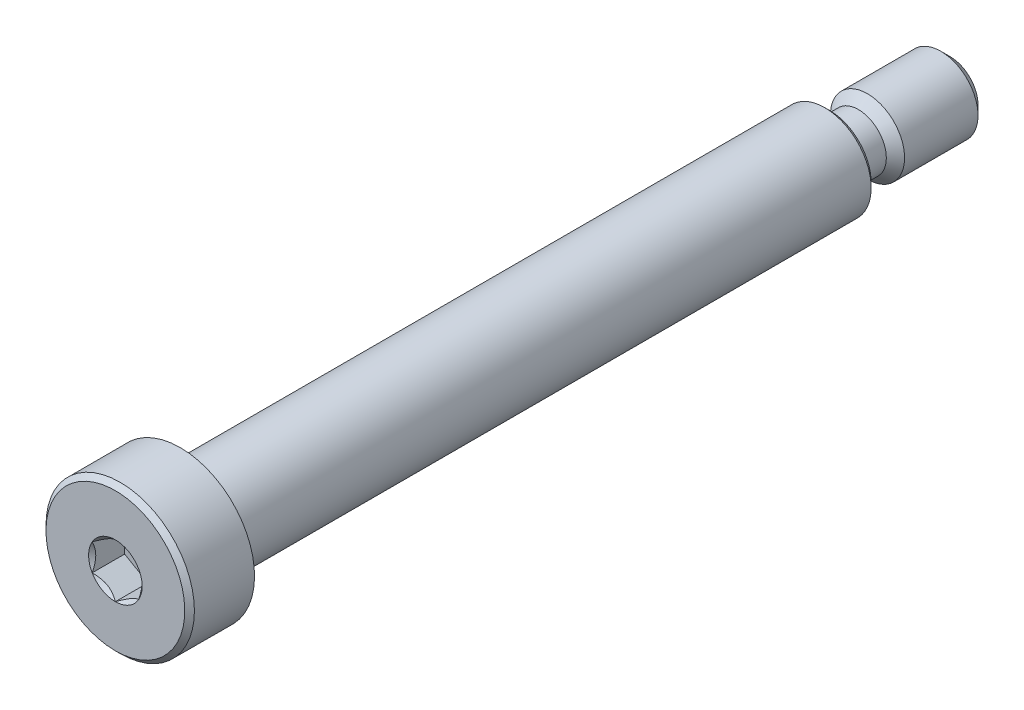
ISO-10303-21;
HEADER;
FILE_DESCRIPTION(('STEP AP214'),'2;1');
FILE_NAME('part.step','',(''),(''),'','','');
FILE_SCHEMA(('AUTOMOTIVE_DESIGN { 1 0 10303 214 1 1 1 1 }'));
ENDSEC;
DATA;
#1=APPLICATION_CONTEXT('core data for automotive mechanical design processes');
#2=APPLICATION_PROTOCOL_DEFINITION('international standard','automotive_design',2000,#1);
#3=PRODUCT_CONTEXT('',#1,'mechanical');
#4=PRODUCT('Part','Part','',(#3));
#5=PRODUCT_RELATED_PRODUCT_CATEGORY('part','',(#4));
#6=PRODUCT_DEFINITION_FORMATION('','',#4);
#7=PRODUCT_DEFINITION_CONTEXT('part definition',#1,'design');
#8=PRODUCT_DEFINITION('design','',#6,#7);
#9=PRODUCT_DEFINITION_SHAPE('','',#8);
#10=(LENGTH_UNIT() NAMED_UNIT(*) SI_UNIT(.MILLI.,.METRE.));
#11=(NAMED_UNIT(*) PLANE_ANGLE_UNIT() SI_UNIT($,.RADIAN.));
#12=(NAMED_UNIT(*) SI_UNIT($,.STERADIAN.) SOLID_ANGLE_UNIT());
#13=UNCERTAINTY_MEASURE_WITH_UNIT(LENGTH_MEASURE(1.E-05),#10,'distance_accuracy_value','');
#14=(GEOMETRIC_REPRESENTATION_CONTEXT(3) GLOBAL_UNCERTAINTY_ASSIGNED_CONTEXT((#13)) GLOBAL_UNIT_ASSIGNED_CONTEXT((#10,
#11,#12)) REPRESENTATION_CONTEXT('',''));
#15=CARTESIAN_POINT('',(0.,0.,0.));
#16=DIRECTION('',(0.,0.,1.));
#17=DIRECTION('',(1.,0.,0.));
#18=AXIS2_PLACEMENT_3D('',#15,#16,#17);
#19=CARTESIAN_POINT('',(0.,0.,0.));
#20=DIRECTION('',(0.,0.,1.));
#21=DIRECTION('',(0.,-1.,0.));
#22=AXIS2_PLACEMENT_3D('',#19,#20,#21);
#23=PLANE('',#22);
#24=CARTESIAN_POINT('',(0.,0.,0.));
#25=DIRECTION('',(0.,0.,1.));
#26=DIRECTION('',(1.,0.,0.));
#27=AXIS2_PLACEMENT_3D('',#24,#25,#26);
#28=CIRCLE('',#27,2.88675134594813);
#29=CARTESIAN_POINT('',(0.,-2.88675134594813,0.));
#30=VERTEX_POINT('',#29);
#31=CARTESIAN_POINT('',(2.5,-1.44337567297407,0.));
#32=VERTEX_POINT('',#31);
#33=EDGE_CURVE('E58',#30,#32,#28,.T.);
#34=ORIENTED_EDGE('',*,*,#33,.F.);
#35=CARTESIAN_POINT('',(-2.5,-1.44337567297407,0.));
#36=VERTEX_POINT('',#35);
#37=EDGE_CURVE('E65',#36,#30,#28,.T.);
#38=ORIENTED_EDGE('',*,*,#37,.F.);
#39=CARTESIAN_POINT('',(-2.5,1.44337567297407,0.));
#40=VERTEX_POINT('',#39);
#41=EDGE_CURVE('E138',#40,#36,#28,.T.);
#42=ORIENTED_EDGE('',*,*,#41,.F.);
#43=CARTESIAN_POINT('',(0.,2.88675134594813,0.));
#44=VERTEX_POINT('',#43);
#45=EDGE_CURVE('E133',#44,#40,#28,.T.);
#46=ORIENTED_EDGE('',*,*,#45,.F.);
#47=CARTESIAN_POINT('',(2.5,1.44337567297407,0.));
#48=VERTEX_POINT('',#47);
#49=EDGE_CURVE('E106',#48,#44,#28,.T.);
#50=ORIENTED_EDGE('',*,*,#49,.F.);
#51=EDGE_CURVE('E97',#32,#48,#28,.T.);
#52=ORIENTED_EDGE('',*,*,#51,.F.);
#53=EDGE_LOOP('',(#34,#38,#42,#46,#50,#52));
#54=FACE_BOUND('',#53,.T.);
#55=CARTESIAN_POINT('',(0.,0.,0.));
#56=DIRECTION('',(0.,0.,1.));
#57=DIRECTION('',(0.,-1.,0.));
#58=AXIS2_PLACEMENT_3D('',#55,#56,#57);
#59=CIRCLE('',#58,7.48000000000001);
#60=CARTESIAN_POINT('',(0.,-7.48000000000001,0.));
#61=VERTEX_POINT('',#60);
#62=EDGE_CURVE('E52',#61,#61,#59,.T.);
#63=ORIENTED_EDGE('',*,*,#62,.T.);
#64=EDGE_LOOP('',(#63));
#65=FACE_BOUND('',#64,.T.);
#66=ADVANCED_FACE('F39',(#54,#65),#23,.T.);
#67=CARTESIAN_POINT('',(0.,0.,-90.));
#68=DIRECTION('',(0.,0.,-1.));
#69=DIRECTION('',(0.,1.,0.));
#70=AXIS2_PLACEMENT_3D('',#67,#68,#69);
#71=CYLINDRICAL_SURFACE('',#70,8.);
#72=CARTESIAN_POINT('',(0.,0.,-0.519999999999979));
#73=DIRECTION('',(0.,0.,1.));
#74=DIRECTION('',(0.,-1.,0.));
#75=AXIS2_PLACEMENT_3D('',#72,#73,#74);
#76=CIRCLE('',#75,8.);
#77=CARTESIAN_POINT('',(0.,-8.,-0.519999999999979));
#78=VERTEX_POINT('',#77);
#79=EDGE_CURVE('E225',#78,#78,#76,.F.);
#80=ORIENTED_EDGE('',*,*,#79,.T.);
#81=EDGE_LOOP('',(#80));
#82=FACE_BOUND('',#81,.T.);
#83=CARTESIAN_POINT('',(0.,0.,-7.00000000000001));
#84=DIRECTION('',(0.,0.,-1.));
#85=DIRECTION('',(0.,1.,0.));
#86=AXIS2_PLACEMENT_3D('',#83,#84,#85);
#87=CIRCLE('',#86,8.);
#88=CARTESIAN_POINT('',(0.,8.,-7.00000000000001));
#89=VERTEX_POINT('',#88);
#90=EDGE_CURVE('E240',#89,#89,#87,.T.);
#91=ORIENTED_EDGE('',*,*,#90,.F.);
#92=EDGE_LOOP('',(#91));
#93=FACE_BOUND('',#92,.T.);
#94=ADVANCED_FACE('F194',(#82,#93),#71,.T.);
#95=CARTESIAN_POINT('',(0.,-8.,-7.));
#96=DIRECTION('',(0.,0.,-1.));
#97=DIRECTION('',(0.,1.,0.));
#98=AXIS2_PLACEMENT_3D('',#95,#96,#97);
#99=PLANE('',#98);
#100=ORIENTED_EDGE('',*,*,#90,.T.);
#101=EDGE_LOOP('',(#100));
#102=FACE_BOUND('',#101,.T.);
#103=CARTESIAN_POINT('',(0.,0.,-7.00000000000001));
#104=DIRECTION('',(0.,0.,-1.));
#105=DIRECTION('',(0.,1.,0.));
#106=AXIS2_PLACEMENT_3D('',#103,#104,#105);
#107=CIRCLE('',#106,5.00000000000002);
#108=CARTESIAN_POINT('',(0.,5.00000000000002,-7.00000000000001));
#109=VERTEX_POINT('',#108);
#110=EDGE_CURVE('E242',#109,#109,#107,.T.);
#111=ORIENTED_EDGE('',*,*,#110,.F.);
#112=EDGE_LOOP('',(#111));
#113=FACE_BOUND('',#112,.T.);
#114=ADVANCED_FACE('F199',(#102,#113),#99,.T.);
#115=CARTESIAN_POINT('',(0.,0.,-90.));
#116=DIRECTION('',(0.,0.,-1.));
#117=DIRECTION('',(0.,1.,0.));
#118=AXIS2_PLACEMENT_3D('',#115,#116,#117);
#119=CYLINDRICAL_SURFACE('',#118,5.00000000000001);
#120=CARTESIAN_POINT('',(0.,0.,-76.48));
#121=DIRECTION('',(0.,0.,-1.));
#122=DIRECTION('',(0.,1.,0.));
#123=AXIS2_PLACEMENT_3D('',#120,#121,#122);
#124=CIRCLE('',#123,5.00000000000001);
#125=CARTESIAN_POINT('',(0.,5.00000000000001,-76.48));
#126=VERTEX_POINT('',#125);
#127=EDGE_CURVE('E218',#126,#126,#124,.F.);
#128=ORIENTED_EDGE('',*,*,#127,.T.);
#129=EDGE_LOOP('',(#128));
#130=FACE_BOUND('',#129,.T.);
#131=ORIENTED_EDGE('',*,*,#110,.T.);
#132=EDGE_LOOP('',(#131));
#133=FACE_BOUND('',#132,.T.);
#134=ADVANCED_FACE('F343',(#130,#133),#119,.T.);
#135=CARTESIAN_POINT('',(0.,-5.,-77.));
#136=DIRECTION('',(0.,0.,-1.));
#137=DIRECTION('',(0.,1.,0.));
#138=AXIS2_PLACEMENT_3D('',#135,#136,#137);
#139=PLANE('',#138);
#140=CARTESIAN_POINT('',(0.,0.,-77.));
#141=DIRECTION('',(0.,0.,-1.));
#142=DIRECTION('',(0.,1.,0.));
#143=AXIS2_PLACEMENT_3D('',#140,#141,#142);
#144=CIRCLE('',#143,4.48000000000001);
#145=CARTESIAN_POINT('',(0.,4.48000000000001,-77.));
#146=VERTEX_POINT('',#145);
#147=EDGE_CURVE('E221',#146,#146,#144,.T.);
#148=ORIENTED_EDGE('',*,*,#147,.T.);
#149=EDGE_LOOP('',(#148));
#150=FACE_BOUND('',#149,.T.);
#151=CARTESIAN_POINT('',(0.,0.,-77.));
#152=DIRECTION('',(0.,0.,-1.));
#153=DIRECTION('',(0.,1.,0.));
#154=AXIS2_PLACEMENT_3D('',#151,#152,#153);
#155=CIRCLE('',#154,4.00000000000003);
#156=CARTESIAN_POINT('',(0.,4.00000000000003,-77.));
#157=VERTEX_POINT('',#156);
#158=EDGE_CURVE('E251',#157,#157,#155,.T.);
#159=ORIENTED_EDGE('',*,*,#158,.F.);
#160=EDGE_LOOP('',(#159));
#161=FACE_BOUND('',#160,.T.);
#162=ADVANCED_FACE('F350',(#150,#161),#139,.T.);
#163=CARTESIAN_POINT('',(0.,0.,-77.985));
#164=DIRECTION('',(0.,0.,-1.));
#165=DIRECTION('',(0.,1.,0.));
#166=AXIS2_PLACEMENT_3D('',#163,#164,#165);
#167=TOROIDAL_SURFACE('',#166,4.00000000000003,0.985000000000028);
#168=CARTESIAN_POINT('',(0.,0.,-77.985));
#169=DIRECTION('',(0.,0.,-1.));
#170=DIRECTION('',(0.,1.,0.));
#171=AXIS2_PLACEMENT_3D('',#168,#169,#170);
#172=CIRCLE('',#171,3.015);
#173=CARTESIAN_POINT('',(0.,3.015,-77.985));
#174=VERTEX_POINT('',#173);
#175=EDGE_CURVE('E255',#174,#174,#172,.T.);
#176=ORIENTED_EDGE('',*,*,#175,.F.);
#177=EDGE_LOOP('',(#176));
#178=FACE_BOUND('',#177,.T.);
#179=ORIENTED_EDGE('',*,*,#158,.T.);
#180=EDGE_LOOP('',(#179));
#181=FACE_BOUND('',#180,.T.);
#182=ADVANCED_FACE('F358',(#178,#181),#167,.F.);
#183=CARTESIAN_POINT('',(0.,0.,-90.));
#184=DIRECTION('',(0.,0.,-1.));
#185=DIRECTION('',(0.,1.,0.));
#186=AXIS2_PLACEMENT_3D('',#183,#184,#185);
#187=CYLINDRICAL_SURFACE('',#186,3.015);
#188=CARTESIAN_POINT('',(0.,0.,-80.1));
#189=DIRECTION('',(0.,0.,-1.));
#190=DIRECTION('',(0.,1.,0.));
#191=AXIS2_PLACEMENT_3D('',#188,#189,#190);
#192=CIRCLE('',#191,3.015);
#193=CARTESIAN_POINT('',(0.,3.015,-80.1));
#194=VERTEX_POINT('',#193);
#195=EDGE_CURVE('E259',#194,#194,#192,.T.);
#196=ORIENTED_EDGE('',*,*,#195,.F.);
#197=EDGE_LOOP('',(#196));
#198=FACE_BOUND('',#197,.T.);
#199=ORIENTED_EDGE('',*,*,#175,.T.);
#200=EDGE_LOOP('',(#199));
#201=FACE_BOUND('',#200,.T.);
#202=ADVANCED_FACE('F384',(#198,#201),#187,.T.);
#203=CARTESIAN_POINT('',(0.,0.,-80.1));
#204=DIRECTION('',(0.,0.,-1.));
#205=DIRECTION('',(0.,1.,0.));
#206=AXIS2_PLACEMENT_3D('',#203,#204,#205);
#207=CONICAL_SURFACE('',#206,3.015,0.785398163397445);
#208=CARTESIAN_POINT('',(0.,0.,-81.0850000000001));
#209=DIRECTION('',(0.,0.,-1.));
#210=DIRECTION('',(0.,1.,0.));
#211=AXIS2_PLACEMENT_3D('',#208,#209,#210);
#212=CIRCLE('',#211,4.00000000000003);
#213=CARTESIAN_POINT('',(0.,4.00000000000003,-81.0850000000001));
#214=VERTEX_POINT('',#213);
#215=EDGE_CURVE('E246',#214,#214,#212,.F.);
#216=ORIENTED_EDGE('',*,*,#215,.T.);
#217=EDGE_LOOP('',(#216));
#218=FACE_BOUND('',#217,.T.);
#219=ORIENTED_EDGE('',*,*,#195,.T.);
#220=EDGE_LOOP('',(#219));
#221=FACE_BOUND('',#220,.T.);
#222=ADVANCED_FACE('F375',(#218,#221),#207,.T.);
#223=CARTESIAN_POINT('',(0.,-4.00000000000003,-90.));
#224=DIRECTION('',(0.,0.,-1.));
#225=DIRECTION('',(0.,1.,0.));
#226=AXIS2_PLACEMENT_3D('',#223,#224,#225);
#227=PLANE('',#226);
#228=CARTESIAN_POINT('',(0.,0.,-90.));
#229=DIRECTION('',(0.,0.,-1.));
#230=DIRECTION('',(0.,1.,0.));
#231=AXIS2_PLACEMENT_3D('',#228,#229,#230);
#232=CIRCLE('',#231,3.00000000000003);
#233=CARTESIAN_POINT('',(0.,3.00000000000003,-90.));
#234=VERTEX_POINT('',#233);
#235=EDGE_CURVE('E228',#234,#234,#232,.T.);
#236=ORIENTED_EDGE('',*,*,#235,.T.);
#237=EDGE_LOOP('',(#236));
#238=FACE_BOUND('',#237,.T.);
#239=ADVANCED_FACE('F366',(#238),#227,.T.);
#240=CARTESIAN_POINT('',(0.,0.,-90.));
#241=DIRECTION('',(0.,0.,-1.));
#242=DIRECTION('',(0.,1.,0.));
#243=AXIS2_PLACEMENT_3D('',#240,#241,#242);
#244=CYLINDRICAL_SURFACE('',#243,4.00000000000003);
#245=CARTESIAN_POINT('',(0.,0.,-89.));
#246=DIRECTION('',(0.,0.,-1.));
#247=DIRECTION('',(0.,1.,0.));
#248=AXIS2_PLACEMENT_3D('',#245,#246,#247);
#249=CIRCLE('',#248,4.00000000000003);
#250=CARTESIAN_POINT('',(0.,4.00000000000003,-89.));
#251=VERTEX_POINT('',#250);
#252=EDGE_CURVE('E223',#251,#251,#249,.F.);
#253=ORIENTED_EDGE('',*,*,#252,.T.);
#254=EDGE_LOOP('',(#253));
#255=FACE_BOUND('',#254,.T.);
#256=ORIENTED_EDGE('',*,*,#215,.F.);
#257=EDGE_LOOP('',(#256));
#258=FACE_BOUND('',#257,.T.);
#259=ADVANCED_FACE('F207',(#255,#258),#244,.T.);
#260=CARTESIAN_POINT('',(0.,0.,-90.));
#261=DIRECTION('',(0.,0.,1.));
#262=DIRECTION('',(0.,-1.,0.));
#263=AXIS2_PLACEMENT_3D('',#260,#261,#262);
#264=CONICAL_SURFACE('',#263,3.00000000000003,0.785398163397439);
#265=ORIENTED_EDGE('',*,*,#252,.F.);
#266=EDGE_LOOP('',(#265));
#267=FACE_BOUND('',#266,.T.);
#268=ORIENTED_EDGE('',*,*,#235,.F.);
#269=EDGE_LOOP('',(#268));
#270=FACE_BOUND('',#269,.T.);
#271=ADVANCED_FACE('F204',(#267,#270),#264,.T.);
#272=CARTESIAN_POINT('',(0.,0.,-77.));
#273=DIRECTION('',(0.,0.,1.));
#274=DIRECTION('',(0.,-1.,0.));
#275=AXIS2_PLACEMENT_3D('',#272,#273,#274);
#276=CONICAL_SURFACE('',#275,4.48000000000001,0.785398163397452);
#277=ORIENTED_EDGE('',*,*,#127,.F.);
#278=EDGE_LOOP('',(#277));
#279=FACE_BOUND('',#278,.T.);
#280=ORIENTED_EDGE('',*,*,#147,.F.);
#281=EDGE_LOOP('',(#280));
#282=FACE_BOUND('',#281,.T.);
#283=ADVANCED_FACE('F206',(#279,#282),#276,.T.);
#284=CARTESIAN_POINT('',(0.,0.,-0.519999999999979));
#285=DIRECTION('',(0.,0.,-1.));
#286=DIRECTION('',(0.,1.,0.));
#287=AXIS2_PLACEMENT_3D('',#284,#285,#286);
#288=CONICAL_SURFACE('',#287,8.,0.785398163397452);
#289=ORIENTED_EDGE('',*,*,#62,.F.);
#290=EDGE_LOOP('',(#289));
#291=FACE_BOUND('',#290,.T.);
#292=ORIENTED_EDGE('',*,*,#79,.F.);
#293=EDGE_LOOP('',(#292));
#294=FACE_BOUND('',#293,.T.);
#295=ADVANCED_FACE('F41',(#291,#294),#288,.T.);
#296=CARTESIAN_POINT('',(0.,0.,0.));
#297=DIRECTION('',(0.,0.,1.));
#298=DIRECTION('',(1.,0.,0.));
#299=AXIS2_PLACEMENT_3D('',#296,#297,#298);
#300=CONICAL_SURFACE('',#299,2.88675134594813,0.78539816339745);
#301=ORIENTED_EDGE('',*,*,#49,.T.);
#302=CARTESIAN_POINT('',(2.5002,1.44326020292023,0.000115476981763763));
#303=CARTESIAN_POINT('',(2.41426172221224,1.49287669073469,-0.0494592946452732));
#304=CARTESIAN_POINT('',(2.32688643272425,1.5433228376411,-0.0961225186374947));
#305=CARTESIAN_POINT('',(2.14871854383441,1.64618811625259,-0.181561859961699));
#306=CARTESIAN_POINT('',(2.05790899931892,1.69861703122359,-0.220290437593998));
#307=CARTESIAN_POINT('',(1.87479587687308,1.80433744175986,-0.286633296102262));
#308=CARTESIAN_POINT('',(1.78253893547066,1.85760201171315,-0.314414331469144));
#309=CARTESIAN_POINT('',(1.59599399122371,1.96530378549009,-0.357216824089334));
#310=CARTESIAN_POINT('',(1.50171168743372,2.01973769896307,-0.372270233328656));
#311=CARTESIAN_POINT('',(1.33922174170815,2.11355131286833,-0.385852277790517));
#312=CARTESIAN_POINT('',(1.27122403211985,2.15280980880341,-0.387862900759197));
#313=CARTESIAN_POINT('',(1.13533975883078,2.23126263056549,-0.38447588281251));
#314=CARTESIAN_POINT('',(1.06745324244776,2.27045692907358,-0.379075644700179));
#315=CARTESIAN_POINT('',(0.932321211763894,2.34847544336505,-0.361174211597527));
#316=CARTESIAN_POINT('',(0.86507650024644,2.38729919566123,-0.348665072953518));
#317=CARTESIAN_POINT('',(0.731749899181801,2.46427534467604,-0.317232498044291));
#318=CARTESIAN_POINT('',(0.665667920900343,2.50242779262542,-0.29830955350318));
#319=CARTESIAN_POINT('',(0.496403653308735,2.60015256308362,-0.242132638591751));
#320=CARTESIAN_POINT('',(0.394270877777107,2.65911894852989,-0.200644168403811));
#321=CARTESIAN_POINT('',(0.244093585059491,2.74582384890657,-0.130605953276911));
#322=CARTESIAN_POINT('',(0.194603460117391,2.77439698586412,-0.105997747883925));
#323=CARTESIAN_POINT('',(0.0965399361611532,2.83101398781794,-0.0545381132847637));
#324=CARTESIAN_POINT('',(0.047965996503072,2.85905816495513,-0.0276880612206434));
#325=CARTESIAN_POINT('',(-0.000199999999999813,2.88686681600197,0.000115476981764549));
#326=B_SPLINE_CURVE_WITH_KNOTS('',3,(#302,#303,#304,#305,#306,#307,#308,#309,#310,#311,#312,
#313,#314,#315,#316,#317,#318,#319,#320,#321,#322,#323,#324,#325),.UNSPECIFIED.,.F.,.F.,(4,2,2,
2,2,2,2,2,2,2,2,4),(0.,0.333012085133925,0.667964518301397,0.997597032043299,1.32639954393844,
1.56169424147169,1.79707142102083,2.03271213522171,2.26833478775651,2.64260240809533,
2.82922877818864,3.01574133749025),.UNSPECIFIED.);
#327=EDGE_CURVE('E11',#48,#44,#326,.T.);
#328=ORIENTED_EDGE('',*,*,#327,.F.);
#329=EDGE_LOOP('',(#301,#328));
#330=FACE_BOUND('',#329,.T.);
#331=ADVANCED_FACE('F109',(#330),#300,.F.);
#332=ORIENTED_EDGE('',*,*,#45,.T.);
#333=CARTESIAN_POINT('',(0.000200000000000308,2.88686681600197,0.000115476981764065));
#334=CARTESIAN_POINT('',(-0.0857382777877644,2.83725032818751,-0.0494592946452727));
#335=CARTESIAN_POINT('',(-0.173113567275753,2.7868041812811,-0.096122518637494));
#336=CARTESIAN_POINT('',(-0.351281456165588,2.6839389026696,-0.181561859961699));
#337=CARTESIAN_POINT('',(-0.442091000681074,2.6315099876986,-0.220290437593998));
#338=CARTESIAN_POINT('',(-0.62520412312692,2.52578957716234,-0.286633296102261));
#339=CARTESIAN_POINT('',(-0.71746106452934,2.47252500720904,-0.314414331469143));
#340=CARTESIAN_POINT('',(-0.904006008776285,2.3648232334321,-0.357216824089333));
#341=CARTESIAN_POINT('',(-0.998288312566282,2.31038931995913,-0.372270233328655));
#342=CARTESIAN_POINT('',(-1.16077825829184,2.21657570605387,-0.385852277790518));
#343=CARTESIAN_POINT('',(-1.22877596788015,2.17731721011878,-0.387862900759197));
#344=CARTESIAN_POINT('',(-1.36466024116922,2.0988643883567,-0.38447588281251));
#345=CARTESIAN_POINT('',(-1.43254675755224,2.05967008984862,-0.379075644700178));
#346=CARTESIAN_POINT('',(-1.5676787882361,1.98165157555715,-0.361174211597527));
#347=CARTESIAN_POINT('',(-1.63492349975356,1.94282782326097,-0.348665072953518));
#348=CARTESIAN_POINT('',(-1.7682501008182,1.86585167424616,-0.317232498044292));
#349=CARTESIAN_POINT('',(-1.83433207909966,1.82769922629678,-0.29830955350318));
#350=CARTESIAN_POINT('',(-2.00359634669126,1.72997445583858,-0.242132638591752));
#351=CARTESIAN_POINT('',(-2.10572912222289,1.67100807039231,-0.200644168403812));
#352=CARTESIAN_POINT('',(-2.25590641494051,1.58430317001562,-0.130605953276912));
#353=CARTESIAN_POINT('',(-2.30539653988261,1.55573003305807,-0.105997747883926));
#354=CARTESIAN_POINT('',(-2.40346006383885,1.49911303110426,-0.0545381132847642));
#355=CARTESIAN_POINT('',(-2.45203400349693,1.47106885396706,-0.0276880612206439));
#356=CARTESIAN_POINT('',(-2.5002,1.44326020292023,0.000115476981763943));
#357=B_SPLINE_CURVE_WITH_KNOTS('',3,(#333,#334,#335,#336,#337,#338,#339,#340,#341,#342,#343,
#344,#345,#346,#347,#348,#349,#350,#351,#352,#353,#354,#355,#356),.UNSPECIFIED.,.F.,.F.,(4,2,2,
2,2,2,2,2,2,2,2,4),(0.,0.333012085133924,0.667964518301397,0.997597032043298,1.32639954393844,
1.56169424147168,1.79707142102083,2.03271213522171,2.2683347877565,2.64260240809533,
2.82922877818864,3.01574133749025),.UNSPECIFIED.);
#358=EDGE_CURVE('E134',#44,#40,#357,.T.);
#359=ORIENTED_EDGE('',*,*,#358,.F.);
#360=EDGE_LOOP('',(#332,#359));
#361=FACE_BOUND('',#360,.T.);
#362=ADVANCED_FACE('F296',(#361),#300,.F.);
#363=ORIENTED_EDGE('',*,*,#41,.T.);
#364=CARTESIAN_POINT('',(-2.5,-2.87868021616154,0.925964193784654));
#365=CARTESIAN_POINT('',(-2.5,-2.80858751756355,0.873054769399494));
#366=CARTESIAN_POINT('',(-2.5,-2.73810237384458,0.820656784806447));
#367=CARTESIAN_POINT('',(-2.5,-2.59619238907469,0.71711268351522));
#368=CARTESIAN_POINT('',(-2.5,-2.52476731657143,0.665966884377933));
#369=CARTESIAN_POINT('',(-2.5,-2.38030019419698,0.564792497981435));
#370=CARTESIAN_POINT('',(-2.5,-2.307249903594,0.514775637784461));
#371=CARTESIAN_POINT('',(-2.5,-2.15990937397294,0.416608843915507));
#372=CARTESIAN_POINT('',(-2.5,-2.08561922308943,0.368458778345536));
#373=CARTESIAN_POINT('',(-2.5,-1.93130274871409,0.271746559451961));
#374=CARTESIAN_POINT('',(-2.5,-1.8511916849785,0.223318932537292));
#375=CARTESIAN_POINT('',(-2.5,-1.68912282627168,0.129664059704143));
#376=CARTESIAN_POINT('',(-2.5,-1.60716527674864,0.0844363916948278));
#377=CARTESIAN_POINT('',(-2.5,-1.44137668632319,-0.00186462533073044));
#378=CARTESIAN_POINT('',(-2.5,-1.35755175925796,-0.0429496273364138));
#379=CARTESIAN_POINT('',(-2.5,-1.1876157775942,-0.120038133893405));
#380=CARTESIAN_POINT('',(-2.5,-1.10150577924729,-0.156043939265442));
#381=CARTESIAN_POINT('',(-2.5,-0.933895283730374,-0.219050255714908));
#382=CARTESIAN_POINT('',(-2.5,-0.852581486652412,-0.246542279856903));
#383=CARTESIAN_POINT('',(-2.5,-0.687996185051426,-0.295002885582603));
#384=CARTESIAN_POINT('',(-2.5,-0.604724546085163,-0.315971017761043));
#385=CARTESIAN_POINT('',(-2.5,-0.438105786501649,-0.349940004986969));
#386=CARTESIAN_POINT('',(-2.5,-0.354786957377881,-0.363077366556389));
#387=CARTESIAN_POINT('',(-2.5,-0.187258638268772,-0.381129805600403));
#388=CARTESIAN_POINT('',(-2.5,-0.103049303891732,-0.386046296469838));
#389=CARTESIAN_POINT('',(-2.5,0.0623819458555501,-0.387291925628103));
#390=CARTESIAN_POINT('',(-2.5,0.143601667742495,-0.383925448289117));
#391=CARTESIAN_POINT('',(-2.5,0.305344840533965,-0.369462407619086));
#392=CARTESIAN_POINT('',(-2.5,0.385868223029658,-0.358365093346909));
#393=CARTESIAN_POINT('',(-2.5,0.546999992477731,-0.328857921414662));
#394=CARTESIAN_POINT('',(-2.5,0.62758525815638,-0.310323623169082));
#395=CARTESIAN_POINT('',(-2.5,0.786991930978588,-0.266927667985933));
#396=CARTESIAN_POINT('',(-2.5,0.865813485110825,-0.242066540482562));
#397=CARTESIAN_POINT('',(-2.5,1.11399280220491,-0.154441088760137));
#398=CARTESIAN_POINT('',(-2.5,1.27984027529456,-0.0816966645253846));
#399=CARTESIAN_POINT('',(-2.5,1.52253018655038,0.0395423452678433));
#400=CARTESIAN_POINT('',(-2.5,1.60256472908879,0.0820714512072029));
#401=CARTESIAN_POINT('',(-2.5,1.76081489282124,0.170396524152191));
#402=CARTESIAN_POINT('',(-2.5,1.83903083842887,0.216191902476712));
#403=CARTESIAN_POINT('',(-2.5,1.99000684607168,0.308044678728648));
#404=CARTESIAN_POINT('',(-2.5,2.06284472030444,0.353975635424458));
#405=CARTESIAN_POINT('',(-2.5,2.20727164736135,0.447770245386505));
#406=CARTESIAN_POINT('',(-2.5,2.27886060500402,0.495634045043619));
#407=CARTESIAN_POINT('',(-2.5,2.42037078548403,0.592552236318334));
#408=CARTESIAN_POINT('',(-2.5,2.49030083172878,0.64159379831621));
#409=CARTESIAN_POINT('',(-2.5,2.62920524991558,0.74097383518978));
#410=CARTESIAN_POINT('',(-2.5,2.69817987937839,0.791311949707408));
#411=CARTESIAN_POINT('',(-2.5,2.76675463365823,0.842180297682426));
#412=B_SPLINE_CURVE_WITH_KNOTS('',3,(#364,#365,#366,#367,#368,#369,#370,#371,#372,#373,#374,
#375,#376,#377,#378,#379,#380,#381,#382,#383,#384,#385,#386,#387,#388,#389,#390,#391,#392,#393,
#394,#395,#396,#397,#398,#399,#400,#401,#402,#403,#404,#405,#406,#407,#408,#409,#410,#411),
.UNSPECIFIED.,.F.,.F.,(4,2,2,2,2,2,2,2,2,2,2,2,2,2,2,2,2,2,2,2,2,2,2,4),(0.,0.263465914971114,
0.526997968323238,0.792571943279361,1.05812711983771,1.33890112548018,1.61963802629079,
1.89956181222216,2.17935838571897,2.436638876826,2.69393708705248,2.94660788173135,
3.19923523085016,3.44271854486786,3.68622551313359,3.93398926860573,4.18173229781968,
4.72334004841908,4.99521600382014,5.26704308216966,5.52534341671993,5.78366335141086,
6.03988492204047,6.29603603207541),.UNSPECIFIED.);
#413=EDGE_CURVE('E136',#40,#36,#412,.F.);
#414=ORIENTED_EDGE('',*,*,#413,.F.);
#415=EDGE_LOOP('',(#363,#414));
#416=FACE_BOUND('',#415,.T.);
#417=ADVANCED_FACE('F293',(#416),#300,.F.);
#418=ORIENTED_EDGE('',*,*,#37,.T.);
#419=CARTESIAN_POINT('',(-2.5002,-1.44326020292023,0.00011547698176376));
#420=CARTESIAN_POINT('',(-2.41426172221223,-1.49287669073469,-0.0494592946452731));
#421=CARTESIAN_POINT('',(-2.32688643272425,-1.5433228376411,-0.0961225186374944));
#422=CARTESIAN_POINT('',(-2.14871854383441,-1.64618811625259,-0.181561859961699));
#423=CARTESIAN_POINT('',(-2.05790899931892,-1.69861703122359,-0.220290437593998));
#424=CARTESIAN_POINT('',(-1.87479587687308,-1.80433744175986,-0.286633296102261));
#425=CARTESIAN_POINT('',(-1.78253893547066,-1.85760201171316,-0.314414331469143));
#426=CARTESIAN_POINT('',(-1.59599399122371,-1.96530378549009,-0.357216824089333));
#427=CARTESIAN_POINT('',(-1.50171168743372,-2.01973769896307,-0.372270233328655));
#428=CARTESIAN_POINT('',(-1.33922174170815,-2.11355131286833,-0.385852277790518));
#429=CARTESIAN_POINT('',(-1.27122403211985,-2.15280980880341,-0.387862900759198));
#430=CARTESIAN_POINT('',(-1.13533975883078,-2.23126263056549,-0.384475882812511));
#431=CARTESIAN_POINT('',(-1.06745324244776,-2.27045692907358,-0.379075644700178));
#432=CARTESIAN_POINT('',(-0.932321211763894,-2.34847544336505,-0.361174211597527));
#433=CARTESIAN_POINT('',(-0.86507650024644,-2.38729919566123,-0.348665072953518));
#434=CARTESIAN_POINT('',(-0.731749899181801,-2.46427534467604,-0.317232498044292));
#435=CARTESIAN_POINT('',(-0.665667920900343,-2.50242779262542,-0.29830955350318));
#436=CARTESIAN_POINT('',(-0.496403653308735,-2.60015256308362,-0.242132638591751));
#437=CARTESIAN_POINT('',(-0.394270877777107,-2.65911894852989,-0.200644168403812));
#438=CARTESIAN_POINT('',(-0.244093585059491,-2.74582384890657,-0.130605953276911));
#439=CARTESIAN_POINT('',(-0.194603460117391,-2.77439698586412,-0.105997747883925));
#440=CARTESIAN_POINT('',(-0.0965399361611534,-2.83101398781794,-0.054538113284764));
#441=CARTESIAN_POINT('',(-0.0479659965030723,-2.85905816495513,-0.0276880612206437));
#442=CARTESIAN_POINT('',(0.000199999999999738,-2.88686681600197,0.000115476981764254));
#443=B_SPLINE_CURVE_WITH_KNOTS('',3,(#419,#420,#421,#422,#423,#424,#425,#426,#427,#428,#429,
#430,#431,#432,#433,#434,#435,#436,#437,#438,#439,#440,#441,#442),.UNSPECIFIED.,.F.,.F.,(4,2,2,
2,2,2,2,2,2,2,2,4),(0.,0.333012085133924,0.667964518301396,0.997597032043298,1.32639954393844,
1.56169424147168,1.79707142102083,2.03271213522171,2.26833478775651,2.64260240809533,
2.82922877818864,3.01574133749025),.UNSPECIFIED.);
#444=EDGE_CURVE('E162',#36,#30,#443,.T.);
#445=ORIENTED_EDGE('',*,*,#444,.F.);
#446=EDGE_LOOP('',(#418,#445));
#447=FACE_BOUND('',#446,.T.);
#448=ADVANCED_FACE('F302',(#447),#300,.F.);
#449=ORIENTED_EDGE('',*,*,#33,.T.);
#450=CARTESIAN_POINT('',(-0.000200000000000051,-2.88686681600197,0.000115476981764498));
#451=CARTESIAN_POINT('',(0.0857382777877648,-2.83725032818751,-0.0494592946452724));
#452=CARTESIAN_POINT('',(0.173113567275753,-2.7868041812811,-0.0961225186374937));
#453=CARTESIAN_POINT('',(0.351281456165589,-2.6839389026696,-0.181561859961698));
#454=CARTESIAN_POINT('',(0.442091000681075,-2.6315099876986,-0.220290437593997));
#455=CARTESIAN_POINT('',(0.625204123126921,-2.52578957716234,-0.286633296102261));
#456=CARTESIAN_POINT('',(0.71746106452934,-2.47252500720904,-0.314414331469143));
#457=CARTESIAN_POINT('',(0.904006008776286,-2.3648232334321,-0.357216824089333));
#458=CARTESIAN_POINT('',(0.998288312566283,-2.31038931995913,-0.372270233328655));
#459=CARTESIAN_POINT('',(1.16077825829185,-2.21657570605387,-0.385852277790517));
#460=CARTESIAN_POINT('',(1.22877596788015,-2.17731721011878,-0.387862900759197));
#461=CARTESIAN_POINT('',(1.36466024116922,-2.0988643883567,-0.38447588281251));
#462=CARTESIAN_POINT('',(1.43254675755224,-2.05967008984862,-0.379075644700178));
#463=CARTESIAN_POINT('',(1.56767878823611,-1.98165157555715,-0.361174211597527));
#464=CARTESIAN_POINT('',(1.63492349975356,-1.94282782326097,-0.348665072953518));
#465=CARTESIAN_POINT('',(1.7682501008182,-1.86585167424616,-0.317232498044291));
#466=CARTESIAN_POINT('',(1.83433207909966,-1.82769922629678,-0.29830955350318));
#467=CARTESIAN_POINT('',(2.00359634669126,-1.72997445583858,-0.242132638591752));
#468=CARTESIAN_POINT('',(2.10572912222289,-1.67100807039231,-0.200644168403812));
#469=CARTESIAN_POINT('',(2.25590641494051,-1.58430317001562,-0.130605953276911));
#470=CARTESIAN_POINT('',(2.30539653988261,-1.55573003305807,-0.105997747883926));
#471=CARTESIAN_POINT('',(2.40346006383885,-1.49911303110426,-0.0545381132847639));
#472=CARTESIAN_POINT('',(2.45203400349693,-1.47106885396706,-0.0276880612206436));
#473=CARTESIAN_POINT('',(2.5002,-1.44326020292023,0.00011547698176417));
#474=B_SPLINE_CURVE_WITH_KNOTS('',3,(#450,#451,#452,#453,#454,#455,#456,#457,#458,#459,#460,
#461,#462,#463,#464,#465,#466,#467,#468,#469,#470,#471,#472,#473),.UNSPECIFIED.,.F.,.F.,(4,2,2,
2,2,2,2,2,2,2,2,4),(0.,0.333012085133924,0.667964518301397,0.997597032043299,1.32639954393844,
1.56169424147169,1.79707142102083,2.03271213522171,2.26833478775651,2.64260240809533,
2.82922877818864,3.01574133749025),.UNSPECIFIED.);
#475=EDGE_CURVE('E121',#30,#32,#474,.T.);
#476=ORIENTED_EDGE('',*,*,#475,.F.);
#477=EDGE_LOOP('',(#449,#476));
#478=FACE_BOUND('',#477,.T.);
#479=ADVANCED_FACE('F155',(#478),#300,.F.);
#480=ORIENTED_EDGE('',*,*,#51,.T.);
#481=CARTESIAN_POINT('',(2.5,-2.87868021616154,0.925964193784653));
#482=CARTESIAN_POINT('',(2.5,-2.80858751756355,0.873054769399493));
#483=CARTESIAN_POINT('',(2.5,-2.73810237384458,0.820656784806447));
#484=CARTESIAN_POINT('',(2.5,-2.59619238907469,0.717112683515219));
#485=CARTESIAN_POINT('',(2.5,-2.52476731657143,0.665966884377933));
#486=CARTESIAN_POINT('',(2.5,-2.38030019419698,0.564792497981435));
#487=CARTESIAN_POINT('',(2.5,-2.307249903594,0.514775637784461));
#488=CARTESIAN_POINT('',(2.5,-2.15990937397294,0.416608843915507));
#489=CARTESIAN_POINT('',(2.5,-2.08561922308943,0.368458778345537));
#490=CARTESIAN_POINT('',(2.5,-1.93130274871409,0.271746559451961));
#491=CARTESIAN_POINT('',(2.5,-1.8511916849785,0.223318932537292));
#492=CARTESIAN_POINT('',(2.5,-1.68912282627168,0.129664059704144));
#493=CARTESIAN_POINT('',(2.5,-1.60716527674864,0.0844363916948282));
#494=CARTESIAN_POINT('',(2.5,-1.44137668632319,-0.00186462533072988));
#495=CARTESIAN_POINT('',(2.5,-1.35755175925796,-0.0429496273364133));
#496=CARTESIAN_POINT('',(2.5,-1.1876157775942,-0.120038133893405));
#497=CARTESIAN_POINT('',(2.5,-1.10150577924729,-0.156043939265441));
#498=CARTESIAN_POINT('',(2.5,-0.933895283730374,-0.219050255714908));
#499=CARTESIAN_POINT('',(2.5,-0.852581486652413,-0.246542279856903));
#500=CARTESIAN_POINT('',(2.5,-0.687996185051426,-0.295002885582603));
#501=CARTESIAN_POINT('',(2.5,-0.604724546085163,-0.315971017761043));
#502=CARTESIAN_POINT('',(2.5,-0.438105786501649,-0.349940004986968));
#503=CARTESIAN_POINT('',(2.5,-0.354786957377881,-0.363077366556389));
#504=CARTESIAN_POINT('',(2.5,-0.187258638268771,-0.381129805600402));
#505=CARTESIAN_POINT('',(2.5,-0.103049303891732,-0.386046296469838));
#506=CARTESIAN_POINT('',(2.5,0.0623819458555502,-0.387291925628102));
#507=CARTESIAN_POINT('',(2.5,0.143601667742495,-0.383925448289117));
#508=CARTESIAN_POINT('',(2.5,0.305344840533965,-0.369462407619085));
#509=CARTESIAN_POINT('',(2.5,0.385868223029659,-0.358365093346908));
#510=CARTESIAN_POINT('',(2.5,0.546999992477731,-0.328857921414662));
#511=CARTESIAN_POINT('',(2.5,0.62758525815638,-0.310323623169081));
#512=CARTESIAN_POINT('',(2.5,0.786991930978588,-0.266927667985933));
#513=CARTESIAN_POINT('',(2.5,0.865813485110825,-0.242066540482562));
#514=CARTESIAN_POINT('',(2.5,1.11399280220491,-0.154441088760136));
#515=CARTESIAN_POINT('',(2.5,1.27984027529456,-0.0816966645253836));
#516=CARTESIAN_POINT('',(2.5,1.52253018655038,0.039542345267844));
#517=CARTESIAN_POINT('',(2.5,1.60256472908879,0.0820714512072035));
#518=CARTESIAN_POINT('',(2.5,1.76081489282124,0.170396524152192));
#519=CARTESIAN_POINT('',(2.5,1.83903083842887,0.216191902476712));
#520=CARTESIAN_POINT('',(2.5,1.99000684607168,0.308044678728648));
#521=CARTESIAN_POINT('',(2.5,2.06284472030444,0.353975635424458));
#522=CARTESIAN_POINT('',(2.5,2.20727164736135,0.447770245386506));
#523=CARTESIAN_POINT('',(2.5,2.27886060500402,0.49563404504362));
#524=CARTESIAN_POINT('',(2.5,2.42037078548403,0.592552236318334));
#525=CARTESIAN_POINT('',(2.5,2.49030083172878,0.64159379831621));
#526=CARTESIAN_POINT('',(2.5,2.62920524991558,0.740973835189781));
#527=CARTESIAN_POINT('',(2.5,2.69817987937839,0.791311949707409));
#528=CARTESIAN_POINT('',(2.5,2.76675463365823,0.842180297682427));
#529=B_SPLINE_CURVE_WITH_KNOTS('',3,(#481,#482,#483,#484,#485,#486,#487,#488,#489,#490,#491,
#492,#493,#494,#495,#496,#497,#498,#499,#500,#501,#502,#503,#504,#505,#506,#507,#508,#509,#510,
#511,#512,#513,#514,#515,#516,#517,#518,#519,#520,#521,#522,#523,#524,#525,#526,#527,#528),
.UNSPECIFIED.,.F.,.F.,(4,2,2,2,2,2,2,2,2,2,2,2,2,2,2,2,2,2,2,2,2,2,2,4),(0.,0.263465914971114,
0.526997968323237,0.79257194327936,1.05812711983771,1.33890112548018,1.61963802629079,
1.89956181222216,2.17935838571897,2.436638876826,2.69393708705248,2.94660788173135,
3.19923523085016,3.44271854486786,3.68622551313359,3.93398926860573,4.18173229781968,
4.72334004841908,4.99521600382014,5.26704308216966,5.52534341671993,5.78366335141086,
6.03988492204047,6.29603603207541),.UNSPECIFIED.);
#530=EDGE_CURVE('E101',#32,#48,#529,.T.);
#531=ORIENTED_EDGE('',*,*,#530,.F.);
#532=EDGE_LOOP('',(#480,#531));
#533=FACE_BOUND('',#532,.T.);
#534=ADVANCED_FACE('F99',(#533),#300,.F.);
#535=CARTESIAN_POINT('',(0.,0.,-3.5));
#536=DIRECTION('',(0.,0.,1.));
#537=DIRECTION('',(1.,0.,0.));
#538=AXIS2_PLACEMENT_3D('',#535,#536,#537);
#539=PLANE('',#538);
#540=DIRECTION('',(0.,1.,0.));
#541=VECTOR('',#540,1.);
#542=CARTESIAN_POINT('',(2.5,-1.44337567297407,-3.5));
#543=LINE('',#542,#541);
#544=CARTESIAN_POINT('',(2.5,-1.44337567297407,-3.5));
#545=VERTEX_POINT('',#544);
#546=CARTESIAN_POINT('',(2.5,1.44337567297406,-3.5));
#547=VERTEX_POINT('',#546);
#548=EDGE_CURVE('E120',#545,#547,#543,.T.);
#549=ORIENTED_EDGE('',*,*,#548,.T.);
#550=DIRECTION('',(-0.866025403784439,0.5,0.));
#551=VECTOR('',#550,1.);
#552=CARTESIAN_POINT('',(2.5,1.44337567297406,-3.5));
#553=LINE('',#552,#551);
#554=CARTESIAN_POINT('',(0.,2.88675134594813,-3.5));
#555=VERTEX_POINT('',#554);
#556=EDGE_CURVE('E125',#547,#555,#553,.T.);
#557=ORIENTED_EDGE('',*,*,#556,.T.);
#558=DIRECTION('',(-0.866025403784439,-0.5,0.));
#559=VECTOR('',#558,1.);
#560=CARTESIAN_POINT('',(0.,2.88675134594813,-3.5));
#561=LINE('',#560,#559);
#562=CARTESIAN_POINT('',(-2.5,1.44337567297407,-3.5));
#563=VERTEX_POINT('',#562);
#564=EDGE_CURVE('E281',#555,#563,#561,.T.);
#565=ORIENTED_EDGE('',*,*,#564,.T.);
#566=DIRECTION('',(0.,-1.,0.));
#567=VECTOR('',#566,1.);
#568=CARTESIAN_POINT('',(-2.5,1.44337567297407,-3.5));
#569=LINE('',#568,#567);
#570=CARTESIAN_POINT('',(-2.5,-1.44337567297407,-3.5));
#571=VERTEX_POINT('',#570);
#572=EDGE_CURVE('E278',#563,#571,#569,.T.);
#573=ORIENTED_EDGE('',*,*,#572,.T.);
#574=DIRECTION('',(0.866025403784439,-0.5,0.));
#575=VECTOR('',#574,1.);
#576=CARTESIAN_POINT('',(-2.5,-1.44337567297407,-3.5));
#577=LINE('',#576,#575);
#578=CARTESIAN_POINT('',(0.,-2.88675134594813,-3.5));
#579=VERTEX_POINT('',#578);
#580=EDGE_CURVE('E275',#571,#579,#577,.T.);
#581=ORIENTED_EDGE('',*,*,#580,.T.);
#582=DIRECTION('',(0.866025403784439,0.5,0.));
#583=VECTOR('',#582,1.);
#584=CARTESIAN_POINT('',(0.,-2.88675134594813,-3.5));
#585=LINE('',#584,#583);
#586=EDGE_CURVE('E128',#579,#545,#585,.T.);
#587=ORIENTED_EDGE('',*,*,#586,.T.);
#588=EDGE_LOOP('',(#549,#557,#565,#573,#581,#587));
#589=FACE_BOUND('',#588,.T.);
#590=ADVANCED_FACE('F154',(#589),#539,.T.);
#591=CARTESIAN_POINT('',(2.5,1.44337567297406,-3.5));
#592=DIRECTION('',(0.5,0.866025403784438,0.));
#593=DIRECTION('',(-0.866025403784439,0.5,0.));
#594=AXIS2_PLACEMENT_3D('',#591,#592,#593);
#595=PLANE('',#594);
#596=DIRECTION('',(0.,0.,1.));
#597=VECTOR('',#596,1.);
#598=CARTESIAN_POINT('',(2.5,1.44337567297406,-3.5));
#599=LINE('',#598,#597);
#600=EDGE_CURVE('E117',#547,#48,#599,.T.);
#601=ORIENTED_EDGE('',*,*,#600,.T.);
#602=ORIENTED_EDGE('',*,*,#327,.T.);
#603=DIRECTION('',(0.,0.,1.));
#604=VECTOR('',#603,1.);
#605=CARTESIAN_POINT('',(0.,2.88675134594813,-3.5));
#606=LINE('',#605,#604);
#607=EDGE_CURVE('E127',#555,#44,#606,.T.);
#608=ORIENTED_EDGE('',*,*,#607,.F.);
#609=ORIENTED_EDGE('',*,*,#556,.F.);
#610=EDGE_LOOP('',(#601,#602,#608,#609));
#611=FACE_BOUND('',#610,.T.);
#612=ADVANCED_FACE('F123',(#611),#595,.F.);
#613=CARTESIAN_POINT('',(0.,2.88675134594813,-3.5));
#614=DIRECTION('',(-0.5,0.866025403784439,0.));
#615=DIRECTION('',(-0.866025403784439,-0.5,0.));
#616=AXIS2_PLACEMENT_3D('',#613,#614,#615);
#617=PLANE('',#616);
#618=ORIENTED_EDGE('',*,*,#607,.T.);
#619=ORIENTED_EDGE('',*,*,#358,.T.);
#620=DIRECTION('',(0.,0.,1.));
#621=VECTOR('',#620,1.);
#622=CARTESIAN_POINT('',(-2.5,1.44337567297407,-3.5));
#623=LINE('',#622,#621);
#624=EDGE_CURVE('E265',#563,#40,#623,.T.);
#625=ORIENTED_EDGE('',*,*,#624,.F.);
#626=ORIENTED_EDGE('',*,*,#564,.F.);
#627=EDGE_LOOP('',(#618,#619,#625,#626));
#628=FACE_BOUND('',#627,.T.);
#629=ADVANCED_FACE('F149',(#628),#617,.F.);
#630=CARTESIAN_POINT('',(-2.5,1.44337567297407,-3.5));
#631=DIRECTION('',(-1.,0.,0.));
#632=DIRECTION('',(0.,0.,1.));
#633=AXIS2_PLACEMENT_3D('',#630,#631,#632);
#634=PLANE('',#633);
#635=ORIENTED_EDGE('',*,*,#624,.T.);
#636=ORIENTED_EDGE('',*,*,#413,.T.);
#637=DIRECTION('',(0.,0.,1.));
#638=VECTOR('',#637,1.);
#639=CARTESIAN_POINT('',(-2.5,-1.44337567297407,-3.5));
#640=LINE('',#639,#638);
#641=EDGE_CURVE('E267',#571,#36,#640,.T.);
#642=ORIENTED_EDGE('',*,*,#641,.F.);
#643=ORIENTED_EDGE('',*,*,#572,.F.);
#644=EDGE_LOOP('',(#635,#636,#642,#643));
#645=FACE_BOUND('',#644,.T.);
#646=ADVANCED_FACE('F183',(#645),#634,.F.);
#647=CARTESIAN_POINT('',(-2.5,-1.44337567297407,-3.5));
#648=DIRECTION('',(-0.5,-0.866025403784439,0.));
#649=DIRECTION('',(0.866025403784439,-0.5,0.));
#650=AXIS2_PLACEMENT_3D('',#647,#648,#649);
#651=PLANE('',#650);
#652=ORIENTED_EDGE('',*,*,#641,.T.);
#653=ORIENTED_EDGE('',*,*,#444,.T.);
#654=DIRECTION('',(0.,0.,1.));
#655=VECTOR('',#654,1.);
#656=CARTESIAN_POINT('',(0.,-2.88675134594813,-3.5));
#657=LINE('',#656,#655);
#658=EDGE_CURVE('E269',#579,#30,#657,.T.);
#659=ORIENTED_EDGE('',*,*,#658,.F.);
#660=ORIENTED_EDGE('',*,*,#580,.F.);
#661=EDGE_LOOP('',(#652,#653,#659,#660));
#662=FACE_BOUND('',#661,.T.);
#663=ADVANCED_FACE('F179',(#662),#651,.F.);
#664=CARTESIAN_POINT('',(0.,-2.88675134594813,-3.5));
#665=DIRECTION('',(0.5,-0.866025403784439,0.));
#666=DIRECTION('',(0.866025403784439,0.5,0.));
#667=AXIS2_PLACEMENT_3D('',#664,#665,#666);
#668=PLANE('',#667);
#669=ORIENTED_EDGE('',*,*,#658,.T.);
#670=ORIENTED_EDGE('',*,*,#475,.T.);
#671=DIRECTION('',(0.,0.,1.));
#672=VECTOR('',#671,1.);
#673=CARTESIAN_POINT('',(2.5,-1.44337567297407,-3.5));
#674=LINE('',#673,#672);
#675=EDGE_CURVE('E119',#545,#32,#674,.T.);
#676=ORIENTED_EDGE('',*,*,#675,.F.);
#677=ORIENTED_EDGE('',*,*,#586,.F.);
#678=EDGE_LOOP('',(#669,#670,#676,#677));
#679=FACE_BOUND('',#678,.T.);
#680=ADVANCED_FACE('F176',(#679),#668,.F.);
#681=CARTESIAN_POINT('',(2.5,-1.44337567297407,-3.5));
#682=DIRECTION('',(1.,0.,0.));
#683=DIRECTION('',(0.,0.,-1.));
#684=AXIS2_PLACEMENT_3D('',#681,#682,#683);
#685=PLANE('',#684);
#686=ORIENTED_EDGE('',*,*,#675,.T.);
#687=ORIENTED_EDGE('',*,*,#530,.T.);
#688=ORIENTED_EDGE('',*,*,#600,.F.);
#689=ORIENTED_EDGE('',*,*,#548,.F.);
#690=EDGE_LOOP('',(#686,#687,#688,#689));
#691=FACE_BOUND('',#690,.T.);
#692=ADVANCED_FACE('F115',(#691),#685,.F.);
#693=CLOSED_SHELL('',(#66,#94,#114,#134,#162,#182,#202,#222,#239,#259,#271,#283,#295,#331,#362,
#417,#448,#479,#534,#590,#612,#629,#646,#663,#680,#692));
#694=MANIFOLD_SOLID_BREP('B2',#693);
#695=ADVANCED_BREP_SHAPE_REPRESENTATION('',(#18,#694),#14);
#696=SHAPE_DEFINITION_REPRESENTATION(#9,#695);
ENDSEC;
END-ISO-10303-21;
